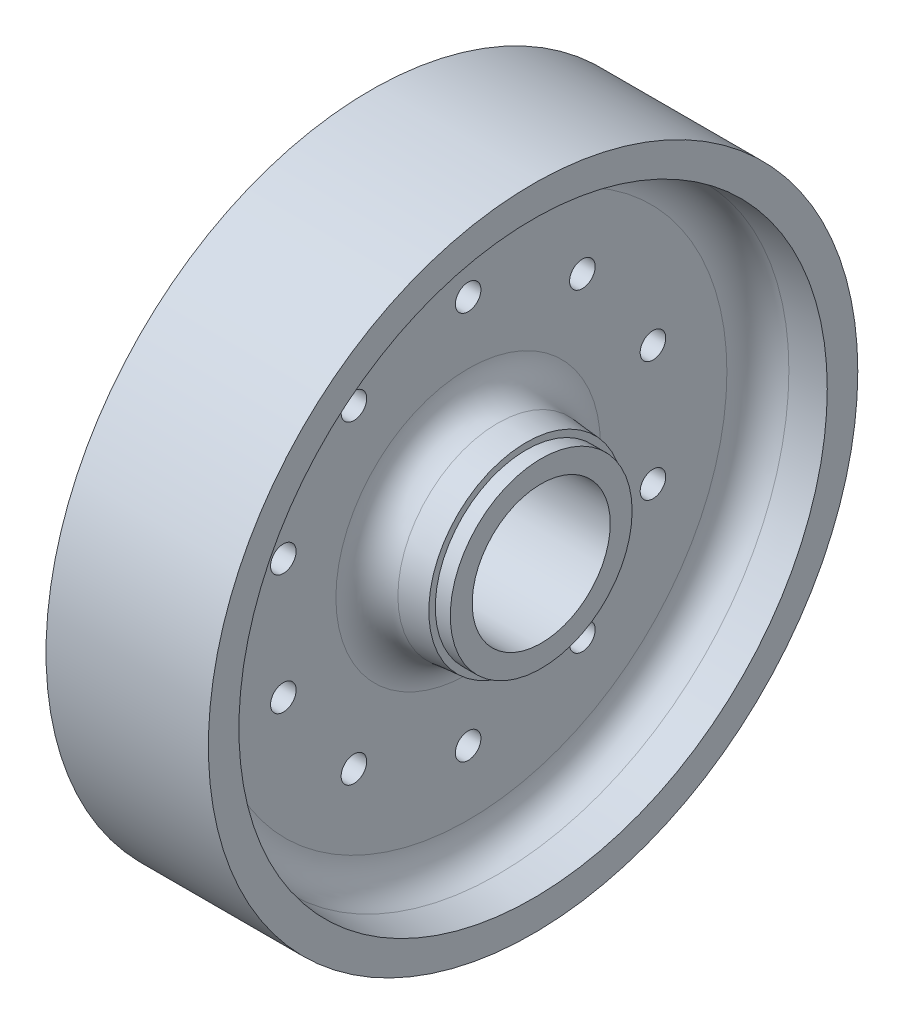
ISO-10303-21;
HEADER;
FILE_DESCRIPTION(('STEP AP214'),'2;1');
FILE_NAME('part.step','',(''),(''),'','','');
FILE_SCHEMA(('AUTOMOTIVE_DESIGN { 1 0 10303 214 1 1 1 1 }'));
ENDSEC;
DATA;
#1=APPLICATION_CONTEXT('core data for automotive mechanical design processes');
#2=APPLICATION_PROTOCOL_DEFINITION('international standard','automotive_design',2000,#1);
#3=PRODUCT_CONTEXT('',#1,'mechanical');
#4=PRODUCT('Part','Part','',(#3));
#5=PRODUCT_RELATED_PRODUCT_CATEGORY('part','',(#4));
#6=PRODUCT_DEFINITION_FORMATION('','',#4);
#7=PRODUCT_DEFINITION_CONTEXT('part definition',#1,'design');
#8=PRODUCT_DEFINITION('design','',#6,#7);
#9=PRODUCT_DEFINITION_SHAPE('','',#8);
#10=(LENGTH_UNIT() NAMED_UNIT(*) SI_UNIT(.MILLI.,.METRE.));
#11=(NAMED_UNIT(*) PLANE_ANGLE_UNIT() SI_UNIT($,.RADIAN.));
#12=(NAMED_UNIT(*) SI_UNIT($,.STERADIAN.) SOLID_ANGLE_UNIT());
#13=UNCERTAINTY_MEASURE_WITH_UNIT(LENGTH_MEASURE(1.E-05),#10,'distance_accuracy_value','');
#14=(GEOMETRIC_REPRESENTATION_CONTEXT(3) GLOBAL_UNCERTAINTY_ASSIGNED_CONTEXT((#13)) GLOBAL_UNIT_ASSIGNED_CONTEXT((#10,
#11,#12)) REPRESENTATION_CONTEXT('',''));
#15=CARTESIAN_POINT('',(0.,0.,0.));
#16=DIRECTION('',(0.,0.,1.));
#17=DIRECTION('',(1.,0.,0.));
#18=AXIS2_PLACEMENT_3D('',#15,#16,#17);
#19=CARTESIAN_POINT('',(-14.5288000000009,19.049999999999,0.));
#20=DIRECTION('',(-1.,0.,0.));
#21=DIRECTION('',(0.,0.,1.));
#22=AXIS2_PLACEMENT_3D('',#19,#20,#21);
#23=PLANE('',#22);
#24=CARTESIAN_POINT('',(-14.5288000000009,0.,0.));
#25=DIRECTION('',(1.,0.,0.));
#26=DIRECTION('',(0.,0.,-1.));
#27=AXIS2_PLACEMENT_3D('',#24,#25,#26);
#28=CIRCLE('',#27,17.779999999999);
#29=CARTESIAN_POINT('',(-14.5288000000009,0.,-17.779999999999));
#30=VERTEX_POINT('',#29);
#31=EDGE_CURVE('E98',#30,#30,#28,.T.);
#32=ORIENTED_EDGE('',*,*,#31,.T.);
#33=EDGE_LOOP('',(#32));
#34=FACE_BOUND('',#33,.T.);
#35=CARTESIAN_POINT('',(-14.5288000000009,0.,0.));
#36=DIRECTION('',(1.,0.,0.));
#37=DIRECTION('',(0.,0.,-1.));
#38=AXIS2_PLACEMENT_3D('',#35,#36,#37);
#39=CIRCLE('',#38,19.049999999999);
#40=CARTESIAN_POINT('',(-14.5288000000009,0.,-19.049999999999));
#41=VERTEX_POINT('',#40);
#42=EDGE_CURVE('E10',#41,#41,#39,.T.);
#43=ORIENTED_EDGE('',*,*,#42,.F.);
#44=EDGE_LOOP('',(#43));
#45=FACE_BOUND('',#44,.T.);
#46=ADVANCED_FACE('F34',(#34,#45),#23,.T.);
#47=CARTESIAN_POINT('',(-8.97156103355268,0.,0.));
#48=DIRECTION('',(1.,0.,0.));
#49=DIRECTION('',(0.,0.,-1.));
#50=AXIS2_PLACEMENT_3D('',#47,#48,#49);
#51=CONICAL_SURFACE('',#50,19.536195410068,0.0872664625997704);
#52=ORIENTED_EDGE('',*,*,#42,.T.);
#53=EDGE_LOOP('',(#52));
#54=FACE_BOUND('',#53,.T.);
#55=CARTESIAN_POINT('',(-8.97156103355268,0.,0.));
#56=DIRECTION('',(1.,0.,0.));
#57=DIRECTION('',(0.,0.,-1.));
#58=AXIS2_PLACEMENT_3D('',#55,#56,#57);
#59=CIRCLE('',#58,19.536195410068);
#60=CARTESIAN_POINT('',(-8.97156103355268,0.,-19.536195410068));
#61=VERTEX_POINT('',#60);
#62=EDGE_CURVE('E41',#61,#61,#59,.T.);
#63=ORIENTED_EDGE('',*,*,#62,.F.);
#64=EDGE_LOOP('',(#63));
#65=FACE_BOUND('',#64,.T.);
#66=ADVANCED_FACE('F156',(#54,#65),#51,.T.);
#67=CARTESIAN_POINT('',(-9.52500000000071,0.,0.));
#68=DIRECTION('',(1.,0.,0.));
#69=DIRECTION('',(0.,0.,-1.));
#70=AXIS2_PLACEMENT_3D('',#67,#68,#69);
#71=TOROIDAL_SURFACE('',#70,25.8620317429513,6.35000000000071);
#72=ORIENTED_EDGE('',*,*,#62,.T.);
#73=EDGE_LOOP('',(#72));
#74=FACE_BOUND('',#73,.T.);
#75=CARTESIAN_POINT('',(-3.175,0.,0.));
#76=DIRECTION('',(1.,0.,0.));
#77=DIRECTION('',(0.,0.,-1.));
#78=AXIS2_PLACEMENT_3D('',#75,#76,#77);
#79=CIRCLE('',#78,25.8620317429513);
#80=CARTESIAN_POINT('',(-3.175,0.,-25.8620317429513));
#81=VERTEX_POINT('',#80);
#82=EDGE_CURVE('E46',#81,#81,#79,.T.);
#83=ORIENTED_EDGE('',*,*,#82,.F.);
#84=EDGE_LOOP('',(#83));
#85=FACE_BOUND('',#84,.T.);
#86=ADVANCED_FACE('F154',(#74,#85),#71,.F.);
#87=CARTESIAN_POINT('',(-3.17500000000001,50.6011910182107,0.));
#88=DIRECTION('',(-1.,0.,0.));
#89=DIRECTION('',(0.,0.,1.));
#90=AXIS2_PLACEMENT_3D('',#87,#88,#89);
#91=PLANE('',#90);
#92=CARTESIAN_POINT('',(-3.17500000000001,38.,0.));
#93=DIRECTION('',(-1.,0.,0.));
#94=DIRECTION('',(0.,0.,1.));
#95=AXIS2_PLACEMENT_3D('',#92,#93,#94);
#96=CIRCLE('',#95,2.5);
#97=CARTESIAN_POINT('',(-3.17500000000001,38.,2.49999999999998));
#98=VERTEX_POINT('',#97);
#99=EDGE_CURVE('E95',#98,#98,#96,.T.);
#100=ORIENTED_EDGE('',*,*,#99,.F.);
#101=EDGE_LOOP('',(#100));
#102=FACE_BOUND('',#101,.T.);
#103=CARTESIAN_POINT('',(-3.17500000000001,30.7426457862467,22.3358395871135));
#104=DIRECTION('',(-1.,0.,0.));
#105=DIRECTION('',(0.,0.,1.));
#106=AXIS2_PLACEMENT_3D('',#103,#104,#105);
#107=CIRCLE('',#106,2.50000000000123);
#108=CARTESIAN_POINT('',(-3.17500000000001,30.7426457862467,24.8358395871148));
#109=VERTEX_POINT('',#108);
#110=EDGE_CURVE('E83',#109,#109,#107,.T.);
#111=ORIENTED_EDGE('',*,*,#110,.F.);
#112=EDGE_LOOP('',(#111));
#113=FACE_BOUND('',#112,.T.);
#114=CARTESIAN_POINT('',(-3.17500000000001,-30.7426457862493,22.3358395871101));
#115=DIRECTION('',(-1.,0.,0.));
#116=DIRECTION('',(0.,0.,1.));
#117=AXIS2_PLACEMENT_3D('',#114,#115,#116);
#118=CIRCLE('',#117,2.50000000000037);
#119=CARTESIAN_POINT('',(-3.17500000000001,-30.7426457862493,24.8358395871104));
#120=VERTEX_POINT('',#119);
#121=EDGE_CURVE('E80',#120,#120,#118,.T.);
#122=ORIENTED_EDGE('',*,*,#121,.F.);
#123=EDGE_LOOP('',(#122));
#124=FACE_BOUND('',#123,.T.);
#125=CARTESIAN_POINT('',(-3.17500000000001,30.7426457862495,-22.3358395871152));
#126=DIRECTION('',(-1.,0.,0.));
#127=DIRECTION('',(0.,0.,1.));
#128=AXIS2_PLACEMENT_3D('',#125,#126,#127);
#129=CIRCLE('',#128,2.5);
#130=CARTESIAN_POINT('',(-3.17500000000001,30.7426457862495,-19.8358395871152));
#131=VERTEX_POINT('',#130);
#132=EDGE_CURVE('E77',#131,#131,#129,.T.);
#133=ORIENTED_EDGE('',*,*,#132,.F.);
#134=EDGE_LOOP('',(#133));
#135=FACE_BOUND('',#134,.T.);
#136=CARTESIAN_POINT('',(-3.17500000000001,11.7426457862498,-36.1401476192175));
#137=DIRECTION('',(-1.,0.,0.));
#138=DIRECTION('',(0.,0.,1.));
#139=AXIS2_PLACEMENT_3D('',#136,#137,#138);
#140=CIRCLE('',#139,2.5);
#141=CARTESIAN_POINT('',(-3.17500000000001,11.7426457862498,-33.6401476192175));
#142=VERTEX_POINT('',#141);
#143=EDGE_CURVE('E73',#142,#142,#140,.T.);
#144=ORIENTED_EDGE('',*,*,#143,.F.);
#145=EDGE_LOOP('',(#144));
#146=FACE_BOUND('',#145,.T.);
#147=CARTESIAN_POINT('',(-3.17500000000001,-11.7426457862462,-36.1401476192184));
#148=DIRECTION('',(-1.,0.,0.));
#149=DIRECTION('',(0.,0.,1.));
#150=AXIS2_PLACEMENT_3D('',#147,#148,#149);
#151=CIRCLE('',#150,2.5);
#152=CARTESIAN_POINT('',(-3.17500000000001,-11.7426457862462,-33.6401476192184));
#153=VERTEX_POINT('',#152);
#154=EDGE_CURVE('E69',#153,#153,#151,.T.);
#155=ORIENTED_EDGE('',*,*,#154,.F.);
#156=EDGE_LOOP('',(#155));
#157=FACE_BOUND('',#156,.T.);
#158=CARTESIAN_POINT('',(-3.17500000000001,-30.7426457862466,-22.3358395871172));
#159=DIRECTION('',(-1.,0.,0.));
#160=DIRECTION('',(0.,0.,1.));
#161=AXIS2_PLACEMENT_3D('',#158,#159,#160);
#162=CIRCLE('',#161,2.5);
#163=CARTESIAN_POINT('',(-3.17500000000001,-30.7426457862466,-19.8358395871172));
#164=VERTEX_POINT('',#163);
#165=EDGE_CURVE('E65',#164,#164,#162,.T.);
#166=ORIENTED_EDGE('',*,*,#165,.F.);
#167=EDGE_LOOP('',(#166));
#168=FACE_BOUND('',#167,.T.);
#169=CARTESIAN_POINT('',(-3.17500000000001,-37.9999999999993,-3.9343528435154E-12));
#170=DIRECTION('',(-1.,0.,0.));
#171=DIRECTION('',(0.,0.,1.));
#172=AXIS2_PLACEMENT_3D('',#169,#170,#171);
#173=CIRCLE('',#172,2.5);
#174=CARTESIAN_POINT('',(-3.17500000000001,-37.9999999999993,2.49999999999607));
#175=VERTEX_POINT('',#174);
#176=EDGE_CURVE('E61',#175,#175,#173,.T.);
#177=ORIENTED_EDGE('',*,*,#176,.F.);
#178=EDGE_LOOP('',(#177));
#179=FACE_BOUND('',#178,.T.);
#180=CARTESIAN_POINT('',(-3.17500000000001,-11.7426457862501,36.140147619213));
#181=DIRECTION('',(-1.,0.,0.));
#182=DIRECTION('',(0.,0.,1.));
#183=AXIS2_PLACEMENT_3D('',#180,#181,#182);
#184=CIRCLE('',#183,2.50000000000071);
#185=CARTESIAN_POINT('',(-3.17500000000001,-11.7426457862501,38.6401476192137));
#186=VERTEX_POINT('',#185);
#187=EDGE_CURVE('E57',#186,#186,#184,.T.);
#188=ORIENTED_EDGE('',*,*,#187,.F.);
#189=EDGE_LOOP('',(#188));
#190=FACE_BOUND('',#189,.T.);
#191=CARTESIAN_POINT('',(-3.17500000000001,11.7426457862459,36.1401476192143));
#192=DIRECTION('',(-1.,0.,0.));
#193=DIRECTION('',(0.,0.,1.));
#194=AXIS2_PLACEMENT_3D('',#191,#192,#193);
#195=CIRCLE('',#194,2.50000000000105);
#196=CARTESIAN_POINT('',(-3.17500000000001,11.7426457862459,38.6401476192154));
#197=VERTEX_POINT('',#196);
#198=EDGE_CURVE('E53',#197,#197,#195,.T.);
#199=ORIENTED_EDGE('',*,*,#198,.F.);
#200=EDGE_LOOP('',(#199));
#201=FACE_BOUND('',#200,.T.);
#202=ORIENTED_EDGE('',*,*,#82,.T.);
#203=EDGE_LOOP('',(#202));
#204=FACE_BOUND('',#203,.T.);
#205=CARTESIAN_POINT('',(-3.17500000000001,0.,0.));
#206=DIRECTION('',(1.,0.,0.));
#207=DIRECTION('',(0.,0.,-1.));
#208=AXIS2_PLACEMENT_3D('',#205,#206,#207);
#209=CIRCLE('',#208,50.6011910182107);
#210=CARTESIAN_POINT('',(-3.17500000000001,0.,-50.6011910182107));
#211=VERTEX_POINT('',#210);
#212=EDGE_CURVE('E146',#211,#211,#209,.T.);
#213=ORIENTED_EDGE('',*,*,#212,.F.);
#214=EDGE_LOOP('',(#213));
#215=FACE_BOUND('',#214,.T.);
#216=ADVANCED_FACE('F151',(#102,#113,#124,#135,#146,#157,#168,#179,#190,#201,#204,#215),#91,.T.);
#217=CARTESIAN_POINT('',(-9.52499999999971,0.,0.));
#218=DIRECTION('',(1.,0.,0.));
#219=DIRECTION('',(0.,0.,-1.));
#220=AXIS2_PLACEMENT_3D('',#217,#218,#219);
#221=TOROIDAL_SURFACE('',#220,50.6011910182107,6.3499999999997);
#222=ORIENTED_EDGE('',*,*,#212,.T.);
#223=EDGE_LOOP('',(#222));
#224=FACE_BOUND('',#223,.T.);
#225=CARTESIAN_POINT('',(-8.9715610335524,0.,0.));
#226=DIRECTION('',(1.,0.,0.));
#227=DIRECTION('',(0.,0.,-1.));
#228=AXIS2_PLACEMENT_3D('',#225,#226,#227);
#229=CIRCLE('',#228,56.927027351093);
#230=CARTESIAN_POINT('',(-8.9715610335524,0.,-56.927027351093));
#231=VERTEX_POINT('',#230);
#232=EDGE_CURVE('E143',#231,#231,#229,.T.);
#233=ORIENTED_EDGE('',*,*,#232,.F.);
#234=EDGE_LOOP('',(#233));
#235=FACE_BOUND('',#234,.T.);
#236=ADVANCED_FACE('F163',(#224,#235),#221,.F.);
#237=CARTESIAN_POINT('',(-15.875,0.,0.));
#238=DIRECTION('',(-1.,0.,0.));
#239=DIRECTION('',(0.,0.,1.));
#240=AXIS2_PLACEMENT_3D('',#237,#238,#239);
#241=CONICAL_SURFACE('',#240,57.531,0.0872664625996731);
#242=ORIENTED_EDGE('',*,*,#232,.T.);
#243=EDGE_LOOP('',(#242));
#244=FACE_BOUND('',#243,.T.);
#245=CARTESIAN_POINT('',(-15.875,0.,0.));
#246=DIRECTION('',(1.,0.,0.));
#247=DIRECTION('',(0.,0.,-1.));
#248=AXIS2_PLACEMENT_3D('',#245,#246,#247);
#249=CIRCLE('',#248,57.531);
#250=CARTESIAN_POINT('',(-15.875,0.,-57.531));
#251=VERTEX_POINT('',#250);
#252=EDGE_CURVE('E140',#251,#251,#249,.T.);
#253=ORIENTED_EDGE('',*,*,#252,.F.);
#254=EDGE_LOOP('',(#253));
#255=FACE_BOUND('',#254,.T.);
#256=ADVANCED_FACE('F239',(#244,#255),#241,.F.);
#257=CARTESIAN_POINT('',(-15.875,63.5,0.));
#258=DIRECTION('',(-1.,0.,0.));
#259=DIRECTION('',(0.,0.,1.));
#260=AXIS2_PLACEMENT_3D('',#257,#258,#259);
#261=PLANE('',#260);
#262=ORIENTED_EDGE('',*,*,#252,.T.);
#263=EDGE_LOOP('',(#262));
#264=FACE_BOUND('',#263,.T.);
#265=CARTESIAN_POINT('',(-15.875,0.,0.));
#266=DIRECTION('',(1.,0.,0.));
#267=DIRECTION('',(0.,0.,-1.));
#268=AXIS2_PLACEMENT_3D('',#265,#266,#267);
#269=CIRCLE('',#268,63.5);
#270=CARTESIAN_POINT('',(-15.875,0.,-63.5));
#271=VERTEX_POINT('',#270);
#272=EDGE_CURVE('E137',#271,#271,#269,.T.);
#273=ORIENTED_EDGE('',*,*,#272,.F.);
#274=EDGE_LOOP('',(#273));
#275=FACE_BOUND('',#274,.T.);
#276=ADVANCED_FACE('F235',(#264,#275),#261,.T.);
#277=CARTESIAN_POINT('',(-17.4625,0.,0.));
#278=DIRECTION('',(1.,0.,0.));
#279=DIRECTION('',(0.,0.,-1.));
#280=AXIS2_PLACEMENT_3D('',#277,#278,#279);
#281=CYLINDRICAL_SURFACE('',#280,63.5);
#282=ORIENTED_EDGE('',*,*,#272,.T.);
#283=EDGE_LOOP('',(#282));
#284=FACE_BOUND('',#283,.T.);
#285=CARTESIAN_POINT('',(15.8750000000026,0.,0.));
#286=DIRECTION('',(1.,0.,0.));
#287=DIRECTION('',(0.,0.,-1.));
#288=AXIS2_PLACEMENT_3D('',#285,#286,#287);
#289=CIRCLE('',#288,63.5);
#290=CARTESIAN_POINT('',(15.8750000000026,0.,-63.5));
#291=VERTEX_POINT('',#290);
#292=EDGE_CURVE('E134',#291,#291,#289,.T.);
#293=ORIENTED_EDGE('',*,*,#292,.F.);
#294=EDGE_LOOP('',(#293));
#295=FACE_BOUND('',#294,.T.);
#296=ADVANCED_FACE('F231',(#284,#295),#281,.T.);
#297=CARTESIAN_POINT('',(15.8750000000026,57.5310000000028,0.));
#298=DIRECTION('',(1.,0.,0.));
#299=DIRECTION('',(0.,0.,-1.));
#300=AXIS2_PLACEMENT_3D('',#297,#298,#299);
#301=PLANE('',#300);
#302=ORIENTED_EDGE('',*,*,#292,.T.);
#303=EDGE_LOOP('',(#302));
#304=FACE_BOUND('',#303,.T.);
#305=CARTESIAN_POINT('',(15.8750000000026,0.,0.));
#306=DIRECTION('',(1.,0.,0.));
#307=DIRECTION('',(0.,0.,-1.));
#308=AXIS2_PLACEMENT_3D('',#305,#306,#307);
#309=CIRCLE('',#308,57.5310000000028);
#310=CARTESIAN_POINT('',(15.8750000000026,0.,-57.5310000000028));
#311=VERTEX_POINT('',#310);
#312=EDGE_CURVE('E131',#311,#311,#309,.T.);
#313=ORIENTED_EDGE('',*,*,#312,.F.);
#314=EDGE_LOOP('',(#313));
#315=FACE_BOUND('',#314,.T.);
#316=ADVANCED_FACE('F227',(#304,#315),#301,.T.);
#317=CARTESIAN_POINT('',(8.97156103355497,0.,0.));
#318=DIRECTION('',(1.,0.,0.));
#319=DIRECTION('',(0.,0.,-1.));
#320=AXIS2_PLACEMENT_3D('',#317,#318,#319);
#321=CONICAL_SURFACE('',#320,56.9270273510959,0.0872664625996738);
#322=ORIENTED_EDGE('',*,*,#312,.T.);
#323=EDGE_LOOP('',(#322));
#324=FACE_BOUND('',#323,.T.);
#325=CARTESIAN_POINT('',(8.97156103355497,0.,0.));
#326=DIRECTION('',(1.,0.,0.));
#327=DIRECTION('',(0.,0.,-1.));
#328=AXIS2_PLACEMENT_3D('',#325,#326,#327);
#329=CIRCLE('',#328,56.9270273510959);
#330=CARTESIAN_POINT('',(8.97156103355497,0.,-56.9270273510959));
#331=VERTEX_POINT('',#330);
#332=EDGE_CURVE('E128',#331,#331,#329,.T.);
#333=ORIENTED_EDGE('',*,*,#332,.F.);
#334=EDGE_LOOP('',(#333));
#335=FACE_BOUND('',#334,.T.);
#336=ADVANCED_FACE('F223',(#324,#335),#321,.F.);
#337=CARTESIAN_POINT('',(9.52500000000264,0.,0.));
#338=DIRECTION('',(1.,0.,0.));
#339=DIRECTION('',(0.,0.,-1.));
#340=AXIS2_PLACEMENT_3D('',#337,#338,#339);
#341=TOROIDAL_SURFACE('',#340,50.6011910182097,6.35000000000357);
#342=ORIENTED_EDGE('',*,*,#332,.T.);
#343=EDGE_LOOP('',(#342));
#344=FACE_BOUND('',#343,.T.);
#345=CARTESIAN_POINT('',(3.17499999999908,0.,0.));
#346=DIRECTION('',(1.,0.,0.));
#347=DIRECTION('',(0.,0.,-1.));
#348=AXIS2_PLACEMENT_3D('',#345,#346,#347);
#349=CIRCLE('',#348,50.6011910182097);
#350=CARTESIAN_POINT('',(3.17499999999908,0.,-50.6011910182097));
#351=VERTEX_POINT('',#350);
#352=EDGE_CURVE('E125',#351,#351,#349,.T.);
#353=ORIENTED_EDGE('',*,*,#352,.F.);
#354=EDGE_LOOP('',(#353));
#355=FACE_BOUND('',#354,.T.);
#356=ADVANCED_FACE('F219',(#344,#355),#341,.F.);
#357=CARTESIAN_POINT('',(3.17499999999908,25.8620317429503,0.));
#358=DIRECTION('',(1.,0.,0.));
#359=DIRECTION('',(0.,0.,-1.));
#360=AXIS2_PLACEMENT_3D('',#357,#358,#359);
#361=PLANE('',#360);
#362=CARTESIAN_POINT('',(3.17499999999908,38.,0.));
#363=DIRECTION('',(1.,0.,0.));
#364=DIRECTION('',(0.,0.,-1.));
#365=AXIS2_PLACEMENT_3D('',#362,#363,#364);
#366=CIRCLE('',#365,2.5);
#367=CARTESIAN_POINT('',(3.17499999999908,38.,-2.50000000000003));
#368=VERTEX_POINT('',#367);
#369=EDGE_CURVE('E37',#368,#368,#366,.T.);
#370=ORIENTED_EDGE('',*,*,#369,.F.);
#371=EDGE_LOOP('',(#370));
#372=FACE_BOUND('',#371,.T.);
#373=CARTESIAN_POINT('',(3.17499999999908,30.7426457862467,22.3358395871135));
#374=DIRECTION('',(1.,0.,0.));
#375=DIRECTION('',(0.,0.,-1.));
#376=AXIS2_PLACEMENT_3D('',#373,#374,#375);
#377=CIRCLE('',#376,2.50000000000123);
#378=CARTESIAN_POINT('',(3.17499999999908,30.7426457862467,19.8358395871123));
#379=VERTEX_POINT('',#378);
#380=EDGE_CURVE('E81',#379,#379,#377,.T.);
#381=ORIENTED_EDGE('',*,*,#380,.F.);
#382=EDGE_LOOP('',(#381));
#383=FACE_BOUND('',#382,.T.);
#384=CARTESIAN_POINT('',(3.17499999999908,-30.7426457862493,22.3358395871101));
#385=DIRECTION('',(1.,0.,0.));
#386=DIRECTION('',(0.,0.,-1.));
#387=AXIS2_PLACEMENT_3D('',#384,#385,#386);
#388=CIRCLE('',#387,2.50000000000037);
#389=CARTESIAN_POINT('',(3.17499999999908,-30.7426457862493,19.8358395871097));
#390=VERTEX_POINT('',#389);
#391=EDGE_CURVE('E78',#390,#390,#388,.T.);
#392=ORIENTED_EDGE('',*,*,#391,.F.);
#393=EDGE_LOOP('',(#392));
#394=FACE_BOUND('',#393,.T.);
#395=CARTESIAN_POINT('',(3.17499999999908,30.7426457862495,-22.3358395871152));
#396=DIRECTION('',(1.,0.,0.));
#397=DIRECTION('',(0.,0.,-1.));
#398=AXIS2_PLACEMENT_3D('',#395,#396,#397);
#399=CIRCLE('',#398,2.5);
#400=CARTESIAN_POINT('',(3.17499999999908,30.7426457862495,-24.8358395871152));
#401=VERTEX_POINT('',#400);
#402=EDGE_CURVE('E74',#401,#401,#399,.T.);
#403=ORIENTED_EDGE('',*,*,#402,.F.);
#404=EDGE_LOOP('',(#403));
#405=FACE_BOUND('',#404,.T.);
#406=CARTESIAN_POINT('',(3.17499999999908,11.7426457862498,-36.1401476192175));
#407=DIRECTION('',(1.,0.,0.));
#408=DIRECTION('',(0.,0.,-1.));
#409=AXIS2_PLACEMENT_3D('',#406,#407,#408);
#410=CIRCLE('',#409,2.5);
#411=CARTESIAN_POINT('',(3.17499999999908,11.7426457862498,-38.6401476192175));
#412=VERTEX_POINT('',#411);
#413=EDGE_CURVE('E70',#412,#412,#410,.T.);
#414=ORIENTED_EDGE('',*,*,#413,.F.);
#415=EDGE_LOOP('',(#414));
#416=FACE_BOUND('',#415,.T.);
#417=CARTESIAN_POINT('',(3.17499999999908,-11.7426457862462,-36.1401476192184));
#418=DIRECTION('',(1.,0.,0.));
#419=DIRECTION('',(0.,0.,-1.));
#420=AXIS2_PLACEMENT_3D('',#417,#418,#419);
#421=CIRCLE('',#420,2.5);
#422=CARTESIAN_POINT('',(3.17499999999908,-11.7426457862462,-38.6401476192184));
#423=VERTEX_POINT('',#422);
#424=EDGE_CURVE('E66',#423,#423,#421,.T.);
#425=ORIENTED_EDGE('',*,*,#424,.F.);
#426=EDGE_LOOP('',(#425));
#427=FACE_BOUND('',#426,.T.);
#428=CARTESIAN_POINT('',(3.17499999999908,-30.7426457862466,-22.3358395871172));
#429=DIRECTION('',(1.,0.,0.));
#430=DIRECTION('',(0.,0.,-1.));
#431=AXIS2_PLACEMENT_3D('',#428,#429,#430);
#432=CIRCLE('',#431,2.5);
#433=CARTESIAN_POINT('',(3.17499999999908,-30.7426457862466,-24.8358395871172));
#434=VERTEX_POINT('',#433);
#435=EDGE_CURVE('E62',#434,#434,#432,.T.);
#436=ORIENTED_EDGE('',*,*,#435,.F.);
#437=EDGE_LOOP('',(#436));
#438=FACE_BOUND('',#437,.T.);
#439=CARTESIAN_POINT('',(3.17499999999908,-37.9999999999993,-3.9343528435154E-12));
#440=DIRECTION('',(1.,0.,0.));
#441=DIRECTION('',(0.,0.,-1.));
#442=AXIS2_PLACEMENT_3D('',#439,#440,#441);
#443=CIRCLE('',#442,2.5);
#444=CARTESIAN_POINT('',(3.17499999999908,-37.9999999999993,-2.50000000000394));
#445=VERTEX_POINT('',#444);
#446=EDGE_CURVE('E58',#445,#445,#443,.T.);
#447=ORIENTED_EDGE('',*,*,#446,.F.);
#448=EDGE_LOOP('',(#447));
#449=FACE_BOUND('',#448,.T.);
#450=CARTESIAN_POINT('',(3.17499999999908,-11.7426457862501,36.140147619213));
#451=DIRECTION('',(1.,0.,0.));
#452=DIRECTION('',(0.,0.,-1.));
#453=AXIS2_PLACEMENT_3D('',#450,#451,#452);
#454=CIRCLE('',#453,2.50000000000071);
#455=CARTESIAN_POINT('',(3.17499999999908,-11.7426457862501,33.6401476192123));
#456=VERTEX_POINT('',#455);
#457=EDGE_CURVE('E54',#456,#456,#454,.T.);
#458=ORIENTED_EDGE('',*,*,#457,.F.);
#459=EDGE_LOOP('',(#458));
#460=FACE_BOUND('',#459,.T.);
#461=CARTESIAN_POINT('',(3.17499999999908,11.7426457862459,36.1401476192143));
#462=DIRECTION('',(1.,0.,0.));
#463=DIRECTION('',(0.,0.,-1.));
#464=AXIS2_PLACEMENT_3D('',#461,#462,#463);
#465=CIRCLE('',#464,2.50000000000105);
#466=CARTESIAN_POINT('',(3.17499999999908,11.7426457862459,33.6401476192133));
#467=VERTEX_POINT('',#466);
#468=EDGE_CURVE('E50',#467,#467,#465,.T.);
#469=ORIENTED_EDGE('',*,*,#468,.F.);
#470=EDGE_LOOP('',(#469));
#471=FACE_BOUND('',#470,.T.);
#472=ORIENTED_EDGE('',*,*,#352,.T.);
#473=EDGE_LOOP('',(#472));
#474=FACE_BOUND('',#473,.T.);
#475=CARTESIAN_POINT('',(3.17499999999908,0.,0.));
#476=DIRECTION('',(1.,0.,0.));
#477=DIRECTION('',(0.,0.,-1.));
#478=AXIS2_PLACEMENT_3D('',#475,#476,#477);
#479=CIRCLE('',#478,25.8620317429503);
#480=CARTESIAN_POINT('',(3.17499999999908,0.,-25.8620317429503));
#481=VERTEX_POINT('',#480);
#482=EDGE_CURVE('E122',#481,#481,#479,.T.);
#483=ORIENTED_EDGE('',*,*,#482,.F.);
#484=EDGE_LOOP('',(#483));
#485=FACE_BOUND('',#484,.T.);
#486=ADVANCED_FACE('F215',(#372,#383,#394,#405,#416,#427,#438,#449,#460,#471,#474,#485),#361,.T.);
#487=CARTESIAN_POINT('',(9.52499999999878,0.,0.));
#488=DIRECTION('',(1.,0.,0.));
#489=DIRECTION('',(0.,0.,-1.));
#490=AXIS2_PLACEMENT_3D('',#487,#488,#489);
#491=TOROIDAL_SURFACE('',#490,25.8620317429503,6.3499999999997);
#492=ORIENTED_EDGE('',*,*,#482,.T.);
#493=EDGE_LOOP('',(#492));
#494=FACE_BOUND('',#493,.T.);
#495=CARTESIAN_POINT('',(8.97156103355083,0.,0.));
#496=DIRECTION('',(1.,0.,0.));
#497=DIRECTION('',(0.,0.,-1.));
#498=AXIS2_PLACEMENT_3D('',#495,#496,#497);
#499=CIRCLE('',#498,19.536195410068);
#500=CARTESIAN_POINT('',(8.97156103355083,0.,-19.536195410068));
#501=VERTEX_POINT('',#500);
#502=EDGE_CURVE('E119',#501,#501,#499,.T.);
#503=ORIENTED_EDGE('',*,*,#502,.F.);
#504=EDGE_LOOP('',(#503));
#505=FACE_BOUND('',#504,.T.);
#506=ADVANCED_FACE('F211',(#494,#505),#491,.F.);
#507=CARTESIAN_POINT('',(14.5287999999991,0.,0.));
#508=DIRECTION('',(-1.,0.,0.));
#509=DIRECTION('',(0.,0.,1.));
#510=AXIS2_PLACEMENT_3D('',#507,#508,#509);
#511=CONICAL_SURFACE('',#510,19.049999999999,0.087266462599771);
#512=ORIENTED_EDGE('',*,*,#502,.T.);
#513=EDGE_LOOP('',(#512));
#514=FACE_BOUND('',#513,.T.);
#515=CARTESIAN_POINT('',(14.5287999999991,0.,0.));
#516=DIRECTION('',(1.,0.,0.));
#517=DIRECTION('',(0.,0.,-1.));
#518=AXIS2_PLACEMENT_3D('',#515,#516,#517);
#519=CIRCLE('',#518,19.049999999999);
#520=CARTESIAN_POINT('',(14.5287999999991,0.,-19.049999999999));
#521=VERTEX_POINT('',#520);
#522=EDGE_CURVE('E116',#521,#521,#519,.T.);
#523=ORIENTED_EDGE('',*,*,#522,.F.);
#524=EDGE_LOOP('',(#523));
#525=FACE_BOUND('',#524,.T.);
#526=ADVANCED_FACE('F207',(#514,#525),#511,.T.);
#527=CARTESIAN_POINT('',(14.5287999999991,17.779999999999,0.));
#528=DIRECTION('',(1.,0.,0.));
#529=DIRECTION('',(0.,0.,-1.));
#530=AXIS2_PLACEMENT_3D('',#527,#528,#529);
#531=PLANE('',#530);
#532=ORIENTED_EDGE('',*,*,#522,.T.);
#533=EDGE_LOOP('',(#532));
#534=FACE_BOUND('',#533,.T.);
#535=CARTESIAN_POINT('',(14.5287999999991,0.,0.));
#536=DIRECTION('',(1.,0.,0.));
#537=DIRECTION('',(0.,0.,-1.));
#538=AXIS2_PLACEMENT_3D('',#535,#536,#537);
#539=CIRCLE('',#538,17.779999999999);
#540=CARTESIAN_POINT('',(14.5287999999991,0.,-17.779999999999));
#541=VERTEX_POINT('',#540);
#542=EDGE_CURVE('E113',#541,#541,#539,.T.);
#543=ORIENTED_EDGE('',*,*,#542,.F.);
#544=EDGE_LOOP('',(#543));
#545=FACE_BOUND('',#544,.T.);
#546=ADVANCED_FACE('F203',(#534,#545),#531,.T.);
#547=CARTESIAN_POINT('',(-17.4625,0.,0.));
#548=DIRECTION('',(1.,0.,0.));
#549=DIRECTION('',(0.,0.,-1.));
#550=AXIS2_PLACEMENT_3D('',#547,#548,#549);
#551=CYLINDRICAL_SURFACE('',#550,17.779999999999);
#552=ORIENTED_EDGE('',*,*,#542,.T.);
#553=EDGE_LOOP('',(#552));
#554=FACE_BOUND('',#553,.T.);
#555=CARTESIAN_POINT('',(17.4624999999991,0.,0.));
#556=DIRECTION('',(1.,0.,0.));
#557=DIRECTION('',(0.,0.,-1.));
#558=AXIS2_PLACEMENT_3D('',#555,#556,#557);
#559=CIRCLE('',#558,17.779999999999);
#560=CARTESIAN_POINT('',(17.4624999999991,0.,-17.779999999999));
#561=VERTEX_POINT('',#560);
#562=EDGE_CURVE('E110',#561,#561,#559,.T.);
#563=ORIENTED_EDGE('',*,*,#562,.F.);
#564=EDGE_LOOP('',(#563));
#565=FACE_BOUND('',#564,.T.);
#566=ADVANCED_FACE('F199',(#554,#565),#551,.T.);
#567=CARTESIAN_POINT('',(17.4624999999991,13.500099999999,0.));
#568=DIRECTION('',(1.,0.,0.));
#569=DIRECTION('',(0.,0.,-1.));
#570=AXIS2_PLACEMENT_3D('',#567,#568,#569);
#571=PLANE('',#570);
#572=ORIENTED_EDGE('',*,*,#562,.T.);
#573=EDGE_LOOP('',(#572));
#574=FACE_BOUND('',#573,.T.);
#575=CARTESIAN_POINT('',(17.4624999999991,0.,0.));
#576=DIRECTION('',(1.,0.,0.));
#577=DIRECTION('',(0.,0.,-1.));
#578=AXIS2_PLACEMENT_3D('',#575,#576,#577);
#579=CIRCLE('',#578,13.500099999999);
#580=CARTESIAN_POINT('',(17.4624999999991,0.,-13.500099999999));
#581=VERTEX_POINT('',#580);
#582=EDGE_CURVE('E107',#581,#581,#579,.T.);
#583=ORIENTED_EDGE('',*,*,#582,.F.);
#584=EDGE_LOOP('',(#583));
#585=FACE_BOUND('',#584,.T.);
#586=ADVANCED_FACE('F195',(#574,#585),#571,.T.);
#587=CARTESIAN_POINT('',(-17.4625,0.,0.));
#588=DIRECTION('',(1.,0.,0.));
#589=DIRECTION('',(0.,0.,-1.));
#590=AXIS2_PLACEMENT_3D('',#587,#588,#589);
#591=CYLINDRICAL_SURFACE('',#590,13.500099999999);
#592=ORIENTED_EDGE('',*,*,#582,.T.);
#593=EDGE_LOOP('',(#592));
#594=FACE_BOUND('',#593,.T.);
#595=CARTESIAN_POINT('',(-17.4625000000009,0.,0.));
#596=DIRECTION('',(1.,0.,0.));
#597=DIRECTION('',(0.,0.,-1.));
#598=AXIS2_PLACEMENT_3D('',#595,#596,#597);
#599=CIRCLE('',#598,13.500099999999);
#600=CARTESIAN_POINT('',(-17.4625000000009,0.,-13.500099999999));
#601=VERTEX_POINT('',#600);
#602=EDGE_CURVE('E104',#601,#601,#599,.T.);
#603=ORIENTED_EDGE('',*,*,#602,.F.);
#604=EDGE_LOOP('',(#603));
#605=FACE_BOUND('',#604,.T.);
#606=ADVANCED_FACE('F186',(#594,#605),#591,.F.);
#607=CARTESIAN_POINT('',(-17.4625000000009,17.779999999999,0.));
#608=DIRECTION('',(-1.,0.,0.));
#609=DIRECTION('',(0.,0.,1.));
#610=AXIS2_PLACEMENT_3D('',#607,#608,#609);
#611=PLANE('',#610);
#612=ORIENTED_EDGE('',*,*,#602,.T.);
#613=EDGE_LOOP('',(#612));
#614=FACE_BOUND('',#613,.T.);
#615=CARTESIAN_POINT('',(-17.4625000000009,0.,0.));
#616=DIRECTION('',(1.,0.,0.));
#617=DIRECTION('',(0.,0.,-1.));
#618=AXIS2_PLACEMENT_3D('',#615,#616,#617);
#619=CIRCLE('',#618,17.779999999999);
#620=CARTESIAN_POINT('',(-17.4625000000009,0.,-17.779999999999));
#621=VERTEX_POINT('',#620);
#622=EDGE_CURVE('E101',#621,#621,#619,.T.);
#623=ORIENTED_EDGE('',*,*,#622,.F.);
#624=EDGE_LOOP('',(#623));
#625=FACE_BOUND('',#624,.T.);
#626=ADVANCED_FACE('F176',(#614,#625),#611,.T.);
#627=CARTESIAN_POINT('',(-17.4625,0.,0.));
#628=DIRECTION('',(1.,0.,0.));
#629=DIRECTION('',(0.,0.,-1.));
#630=AXIS2_PLACEMENT_3D('',#627,#628,#629);
#631=CYLINDRICAL_SURFACE('',#630,17.779999999999);
#632=ORIENTED_EDGE('',*,*,#622,.T.);
#633=EDGE_LOOP('',(#632));
#634=FACE_BOUND('',#633,.T.);
#635=ORIENTED_EDGE('',*,*,#31,.F.);
#636=EDGE_LOOP('',(#635));
#637=FACE_BOUND('',#636,.T.);
#638=ADVANCED_FACE('F173',(#634,#637),#631,.T.);
#639=CARTESIAN_POINT('',(-17.4625000000009,11.7426457862459,36.1401476192143));
#640=DIRECTION('',(1.,0.,0.));
#641=DIRECTION('',(0.,0.,-1.));
#642=AXIS2_PLACEMENT_3D('',#639,#640,#641);
#643=CYLINDRICAL_SURFACE('',#642,2.50000000000105);
#644=ORIENTED_EDGE('',*,*,#198,.T.);
#645=EDGE_LOOP('',(#644));
#646=FACE_BOUND('',#645,.T.);
#647=ORIENTED_EDGE('',*,*,#468,.T.);
#648=EDGE_LOOP('',(#647));
#649=FACE_BOUND('',#648,.T.);
#650=ADVANCED_FACE('F175',(#646,#649),#643,.F.);
#651=CARTESIAN_POINT('',(-17.4625000000009,-11.7426457862501,36.140147619213));
#652=DIRECTION('',(1.,0.,0.));
#653=DIRECTION('',(0.,0.,-1.));
#654=AXIS2_PLACEMENT_3D('',#651,#652,#653);
#655=CYLINDRICAL_SURFACE('',#654,2.50000000000071);
#656=ORIENTED_EDGE('',*,*,#187,.T.);
#657=EDGE_LOOP('',(#656));
#658=FACE_BOUND('',#657,.T.);
#659=ORIENTED_EDGE('',*,*,#457,.T.);
#660=EDGE_LOOP('',(#659));
#661=FACE_BOUND('',#660,.T.);
#662=ADVANCED_FACE('F183',(#658,#661),#655,.F.);
#663=CARTESIAN_POINT('',(-17.4625000000009,-37.9999999999993,-3.9343528435154E-12));
#664=DIRECTION('',(1.,0.,0.));
#665=DIRECTION('',(0.,0.,-1.));
#666=AXIS2_PLACEMENT_3D('',#663,#664,#665);
#667=CYLINDRICAL_SURFACE('',#666,2.5);
#668=ORIENTED_EDGE('',*,*,#176,.T.);
#669=EDGE_LOOP('',(#668));
#670=FACE_BOUND('',#669,.T.);
#671=ORIENTED_EDGE('',*,*,#446,.T.);
#672=EDGE_LOOP('',(#671));
#673=FACE_BOUND('',#672,.T.);
#674=ADVANCED_FACE('F379',(#670,#673),#667,.F.);
#675=CARTESIAN_POINT('',(-17.4625000000009,-30.7426457862466,-22.3358395871172));
#676=DIRECTION('',(1.,0.,0.));
#677=DIRECTION('',(0.,0.,-1.));
#678=AXIS2_PLACEMENT_3D('',#675,#676,#677);
#679=CYLINDRICAL_SURFACE('',#678,2.5);
#680=ORIENTED_EDGE('',*,*,#165,.T.);
#681=EDGE_LOOP('',(#680));
#682=FACE_BOUND('',#681,.T.);
#683=ORIENTED_EDGE('',*,*,#435,.T.);
#684=EDGE_LOOP('',(#683));
#685=FACE_BOUND('',#684,.T.);
#686=ADVANCED_FACE('F389',(#682,#685),#679,.F.);
#687=CARTESIAN_POINT('',(-17.4625000000009,-11.7426457862462,-36.1401476192184));
#688=DIRECTION('',(1.,0.,0.));
#689=DIRECTION('',(0.,0.,-1.));
#690=AXIS2_PLACEMENT_3D('',#687,#688,#689);
#691=CYLINDRICAL_SURFACE('',#690,2.5);
#692=ORIENTED_EDGE('',*,*,#154,.T.);
#693=EDGE_LOOP('',(#692));
#694=FACE_BOUND('',#693,.T.);
#695=ORIENTED_EDGE('',*,*,#424,.T.);
#696=EDGE_LOOP('',(#695));
#697=FACE_BOUND('',#696,.T.);
#698=ADVANCED_FACE('F190',(#694,#697),#691,.F.);
#699=CARTESIAN_POINT('',(-17.4625000000009,11.7426457862498,-36.1401476192175));
#700=DIRECTION('',(1.,0.,0.));
#701=DIRECTION('',(0.,0.,-1.));
#702=AXIS2_PLACEMENT_3D('',#699,#700,#701);
#703=CYLINDRICAL_SURFACE('',#702,2.5);
#704=ORIENTED_EDGE('',*,*,#143,.T.);
#705=EDGE_LOOP('',(#704));
#706=FACE_BOUND('',#705,.T.);
#707=ORIENTED_EDGE('',*,*,#413,.T.);
#708=EDGE_LOOP('',(#707));
#709=FACE_BOUND('',#708,.T.);
#710=ADVANCED_FACE('F408',(#706,#709),#703,.F.);
#711=CARTESIAN_POINT('',(-17.4625000000009,30.7426457862495,-22.3358395871152));
#712=DIRECTION('',(1.,0.,0.));
#713=DIRECTION('',(0.,0.,-1.));
#714=AXIS2_PLACEMENT_3D('',#711,#712,#713);
#715=CYLINDRICAL_SURFACE('',#714,2.5);
#716=ORIENTED_EDGE('',*,*,#132,.T.);
#717=EDGE_LOOP('',(#716));
#718=FACE_BOUND('',#717,.T.);
#719=ORIENTED_EDGE('',*,*,#402,.T.);
#720=EDGE_LOOP('',(#719));
#721=FACE_BOUND('',#720,.T.);
#722=ADVANCED_FACE('F417',(#718,#721),#715,.F.);
#723=CARTESIAN_POINT('',(-17.4625000000009,-30.7426457862493,22.3358395871101));
#724=DIRECTION('',(1.,0.,0.));
#725=DIRECTION('',(0.,0.,-1.));
#726=AXIS2_PLACEMENT_3D('',#723,#724,#725);
#727=CYLINDRICAL_SURFACE('',#726,2.50000000000037);
#728=ORIENTED_EDGE('',*,*,#121,.T.);
#729=EDGE_LOOP('',(#728));
#730=FACE_BOUND('',#729,.T.);
#731=ORIENTED_EDGE('',*,*,#391,.T.);
#732=EDGE_LOOP('',(#731));
#733=FACE_BOUND('',#732,.T.);
#734=ADVANCED_FACE('F426',(#730,#733),#727,.F.);
#735=CARTESIAN_POINT('',(-17.4625000000009,30.7426457862467,22.3358395871135));
#736=DIRECTION('',(1.,0.,0.));
#737=DIRECTION('',(0.,0.,-1.));
#738=AXIS2_PLACEMENT_3D('',#735,#736,#737);
#739=CYLINDRICAL_SURFACE('',#738,2.50000000000123);
#740=ORIENTED_EDGE('',*,*,#110,.T.);
#741=EDGE_LOOP('',(#740));
#742=FACE_BOUND('',#741,.T.);
#743=ORIENTED_EDGE('',*,*,#380,.T.);
#744=EDGE_LOOP('',(#743));
#745=FACE_BOUND('',#744,.T.);
#746=ADVANCED_FACE('F436',(#742,#745),#739,.F.);
#747=CARTESIAN_POINT('',(-17.4625000000009,38.,0.));
#748=DIRECTION('',(1.,0.,0.));
#749=DIRECTION('',(0.,0.,-1.));
#750=AXIS2_PLACEMENT_3D('',#747,#748,#749);
#751=CYLINDRICAL_SURFACE('',#750,2.5);
#752=ORIENTED_EDGE('',*,*,#99,.T.);
#753=EDGE_LOOP('',(#752));
#754=FACE_BOUND('',#753,.T.);
#755=ORIENTED_EDGE('',*,*,#369,.T.);
#756=EDGE_LOOP('',(#755));
#757=FACE_BOUND('',#756,.T.);
#758=ADVANCED_FACE('F445',(#754,#757),#751,.F.);
#759=CLOSED_SHELL('',(#46,#66,#86,#216,#236,#256,#276,#296,#316,#336,#356,#486,#506,#526,#546,
#566,#586,#606,#626,#638,#650,#662,#674,#686,#698,#710,#722,#734,#746,#758));
#760=MANIFOLD_SOLID_BREP('B2',#759);
#761=ADVANCED_BREP_SHAPE_REPRESENTATION('',(#18,#760),#14);
#762=SHAPE_DEFINITION_REPRESENTATION(#9,#761);
ENDSEC;
END-ISO-10303-21;
